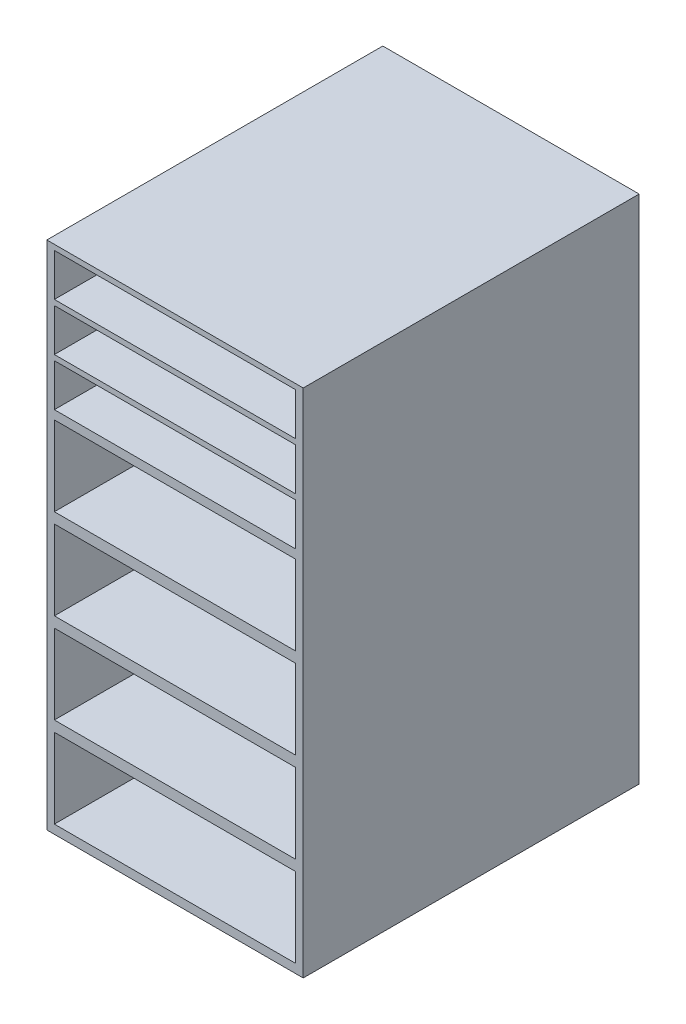
ISO-10303-21;
HEADER;
FILE_DESCRIPTION(('STEP AP214'),'2;1');
FILE_NAME('part.step','',(''),(''),'','','');
FILE_SCHEMA(('AUTOMOTIVE_DESIGN { 1 0 10303 214 1 1 1 1 }'));
ENDSEC;
DATA;
#1=APPLICATION_CONTEXT('core data for automotive mechanical design processes');
#2=APPLICATION_PROTOCOL_DEFINITION('international standard','automotive_design',2000,#1);
#3=PRODUCT_CONTEXT('',#1,'mechanical');
#4=PRODUCT('Part','Part','',(#3));
#5=PRODUCT_RELATED_PRODUCT_CATEGORY('part','',(#4));
#6=PRODUCT_DEFINITION_FORMATION('','',#4);
#7=PRODUCT_DEFINITION_CONTEXT('part definition',#1,'design');
#8=PRODUCT_DEFINITION('design','',#6,#7);
#9=PRODUCT_DEFINITION_SHAPE('','',#8);
#10=(LENGTH_UNIT() NAMED_UNIT(*) SI_UNIT(.MILLI.,.METRE.));
#11=(NAMED_UNIT(*) PLANE_ANGLE_UNIT() SI_UNIT($,.RADIAN.));
#12=(NAMED_UNIT(*) SI_UNIT($,.STERADIAN.) SOLID_ANGLE_UNIT());
#13=UNCERTAINTY_MEASURE_WITH_UNIT(LENGTH_MEASURE(1.E-05),#10,'distance_accuracy_value','');
#14=(GEOMETRIC_REPRESENTATION_CONTEXT(3) GLOBAL_UNCERTAINTY_ASSIGNED_CONTEXT((#13)) GLOBAL_UNIT_ASSIGNED_CONTEXT((#10,
#11,#12)) REPRESENTATION_CONTEXT('',''));
#15=CARTESIAN_POINT('',(0.,0.,0.));
#16=DIRECTION('',(0.,0.,1.));
#17=DIRECTION('',(1.,0.,0.));
#18=AXIS2_PLACEMENT_3D('',#15,#16,#17);
#19=CARTESIAN_POINT('',(34.1249999999999,144.5,47.5));
#20=DIRECTION('',(0.,1.,0.));
#21=DIRECTION('',(0.,0.,1.));
#22=AXIS2_PLACEMENT_3D('',#19,#20,#21);
#23=PLANE('',#22);
#24=DIRECTION('',(1.,0.,0.));
#25=VECTOR('',#24,1.);
#26=CARTESIAN_POINT('',(-34.1250000000001,144.5,47.5));
#27=LINE('',#26,#25);
#28=CARTESIAN_POINT('',(-36.25,144.5,47.5));
#29=VERTEX_POINT('',#28);
#30=CARTESIAN_POINT('',(36.25,144.5,47.5));
#31=VERTEX_POINT('',#30);
#32=EDGE_CURVE('E11',#29,#31,#27,.T.);
#33=ORIENTED_EDGE('',*,*,#32,.T.);
#34=DIRECTION('',(0.,0.,-1.));
#35=VECTOR('',#34,1.);
#36=CARTESIAN_POINT('',(36.25,144.5,47.5));
#37=LINE('',#36,#35);
#38=CARTESIAN_POINT('',(36.25,144.5,-47.5));
#39=VERTEX_POINT('',#38);
#40=EDGE_CURVE('E155',#31,#39,#37,.T.);
#41=ORIENTED_EDGE('',*,*,#40,.T.);
#42=DIRECTION('',(-1.,0.,0.));
#43=VECTOR('',#42,1.);
#44=CARTESIAN_POINT('',(-36.25,144.5,-47.5));
#45=LINE('',#44,#43);
#46=CARTESIAN_POINT('',(-36.25,144.5,-47.5));
#47=VERTEX_POINT('',#46);
#48=EDGE_CURVE('E160',#39,#47,#45,.T.);
#49=ORIENTED_EDGE('',*,*,#48,.T.);
#50=DIRECTION('',(0.,0.,1.));
#51=VECTOR('',#50,1.);
#52=CARTESIAN_POINT('',(-36.25,144.5,47.5));
#53=LINE('',#52,#51);
#54=EDGE_CURVE('E164',#47,#29,#53,.T.);
#55=ORIENTED_EDGE('',*,*,#54,.T.);
#56=EDGE_LOOP('',(#33,#41,#49,#55));
#57=FACE_BOUND('',#56,.T.);
#58=ADVANCED_FACE('F38',(#57),#23,.T.);
#59=CARTESIAN_POINT('',(36.25,104.5,47.5));
#60=DIRECTION('',(-1.,0.,0.));
#61=DIRECTION('',(0.,0.,1.));
#62=AXIS2_PLACEMENT_3D('',#59,#60,#61);
#63=PLANE('',#62);
#64=ORIENTED_EDGE('',*,*,#40,.F.);
#65=DIRECTION('',(0.,-1.,0.));
#66=VECTOR('',#65,1.);
#67=CARTESIAN_POINT('',(36.25,104.5,47.5));
#68=LINE('',#67,#66);
#69=CARTESIAN_POINT('',(36.25,0.,47.5));
#70=VERTEX_POINT('',#69);
#71=EDGE_CURVE('E42',#31,#70,#68,.T.);
#72=ORIENTED_EDGE('',*,*,#71,.T.);
#73=DIRECTION('',(0.,0.,-1.));
#74=VECTOR('',#73,1.);
#75=CARTESIAN_POINT('',(36.25,0.,47.5));
#76=LINE('',#75,#74);
#77=CARTESIAN_POINT('',(36.25,0.,-47.5));
#78=VERTEX_POINT('',#77);
#79=EDGE_CURVE('E203',#70,#78,#76,.T.);
#80=ORIENTED_EDGE('',*,*,#79,.T.);
#81=DIRECTION('',(0.,-1.,0.));
#82=VECTOR('',#81,1.);
#83=CARTESIAN_POINT('',(36.25,104.5,-47.5));
#84=LINE('',#83,#82);
#85=EDGE_CURVE('E159',#39,#78,#84,.T.);
#86=ORIENTED_EDGE('',*,*,#85,.F.);
#87=EDGE_LOOP('',(#64,#72,#80,#86));
#88=FACE_BOUND('',#87,.T.);
#89=ADVANCED_FACE('F630',(#88),#63,.F.);
#90=CARTESIAN_POINT('',(-36.25,104.5,-47.5));
#91=DIRECTION('',(0.,0.,1.));
#92=DIRECTION('',(1.,0.,0.));
#93=AXIS2_PLACEMENT_3D('',#90,#91,#92);
#94=PLANE('',#93);
#95=ORIENTED_EDGE('',*,*,#48,.F.);
#96=ORIENTED_EDGE('',*,*,#85,.T.);
#97=DIRECTION('',(-1.,0.,0.));
#98=VECTOR('',#97,1.);
#99=CARTESIAN_POINT('',(-36.25,0.,-47.5));
#100=LINE('',#99,#98);
#101=CARTESIAN_POINT('',(-36.25,0.,-47.5));
#102=VERTEX_POINT('',#101);
#103=EDGE_CURVE('E197',#78,#102,#100,.T.);
#104=ORIENTED_EDGE('',*,*,#103,.T.);
#105=DIRECTION('',(0.,-1.,0.));
#106=VECTOR('',#105,1.);
#107=CARTESIAN_POINT('',(-36.25,104.5,-47.5));
#108=LINE('',#107,#106);
#109=EDGE_CURVE('E171',#47,#102,#108,.T.);
#110=ORIENTED_EDGE('',*,*,#109,.F.);
#111=EDGE_LOOP('',(#95,#96,#104,#110));
#112=FACE_BOUND('',#111,.T.);
#113=ADVANCED_FACE('F632',(#112),#94,.F.);
#114=CARTESIAN_POINT('',(-36.25,104.5,47.5));
#115=DIRECTION('',(1.,0.,0.));
#116=DIRECTION('',(0.,0.,-1.));
#117=AXIS2_PLACEMENT_3D('',#114,#115,#116);
#118=PLANE('',#117);
#119=ORIENTED_EDGE('',*,*,#54,.F.);
#120=ORIENTED_EDGE('',*,*,#109,.T.);
#121=DIRECTION('',(0.,0.,1.));
#122=VECTOR('',#121,1.);
#123=CARTESIAN_POINT('',(-36.25,0.,47.5));
#124=LINE('',#123,#122);
#125=CARTESIAN_POINT('',(-36.25,0.,47.5));
#126=VERTEX_POINT('',#125);
#127=EDGE_CURVE('E192',#102,#126,#124,.T.);
#128=ORIENTED_EDGE('',*,*,#127,.T.);
#129=DIRECTION('',(0.,-1.,0.));
#130=VECTOR('',#129,1.);
#131=CARTESIAN_POINT('',(-36.25,104.5,47.5));
#132=LINE('',#131,#130);
#133=EDGE_CURVE('E174',#29,#126,#132,.T.);
#134=ORIENTED_EDGE('',*,*,#133,.F.);
#135=EDGE_LOOP('',(#119,#120,#128,#134));
#136=FACE_BOUND('',#135,.T.);
#137=ADVANCED_FACE('F638',(#136),#118,.F.);
#138=CARTESIAN_POINT('',(-36.25,104.5,47.5));
#139=DIRECTION('',(0.,0.,-1.));
#140=DIRECTION('',(-1.,0.,0.));
#141=AXIS2_PLACEMENT_3D('',#138,#139,#140);
#142=PLANE('',#141);
#143=DIRECTION('',(0.,-1.,0.));
#144=VECTOR('',#143,1.);
#145=CARTESIAN_POINT('',(-34.1250000000003,79.,47.5));
#146=LINE('',#145,#144);
#147=CARTESIAN_POINT('',(-34.1250000000003,101.5,47.5));
#148=VERTEX_POINT('',#147);
#149=CARTESIAN_POINT('',(-34.1250000000003,79.,47.5));
#150=VERTEX_POINT('',#149);
#151=EDGE_CURVE('E234',#148,#150,#146,.T.);
#152=ORIENTED_EDGE('',*,*,#151,.F.);
#153=DIRECTION('',(-1.,0.,0.));
#154=VECTOR('',#153,1.);
#155=CARTESIAN_POINT('',(-34.1250000000003,101.5,47.5));
#156=LINE('',#155,#154);
#157=CARTESIAN_POINT('',(34.1249999999997,101.5,47.5));
#158=VERTEX_POINT('',#157);
#159=EDGE_CURVE('E238',#158,#148,#156,.T.);
#160=ORIENTED_EDGE('',*,*,#159,.F.);
#161=DIRECTION('',(0.,1.,0.));
#162=VECTOR('',#161,1.);
#163=CARTESIAN_POINT('',(34.1249999999997,79.,47.5));
#164=LINE('',#163,#162);
#165=CARTESIAN_POINT('',(34.1249999999997,79.,47.5));
#166=VERTEX_POINT('',#165);
#167=EDGE_CURVE('E225',#166,#158,#164,.T.);
#168=ORIENTED_EDGE('',*,*,#167,.F.);
#169=DIRECTION('',(1.,0.,0.));
#170=VECTOR('',#169,1.);
#171=CARTESIAN_POINT('',(-34.1250000000003,79.,47.5));
#172=LINE('',#171,#170);
#173=EDGE_CURVE('E229',#150,#166,#172,.T.);
#174=ORIENTED_EDGE('',*,*,#173,.F.);
#175=EDGE_LOOP('',(#152,#160,#168,#174));
#176=FACE_BOUND('',#175,.T.);
#177=DIRECTION('',(0.,-1.,0.));
#178=VECTOR('',#177,1.);
#179=CARTESIAN_POINT('',(-34.1250000000002,53.5,47.5));
#180=LINE('',#179,#178);
#181=CARTESIAN_POINT('',(-34.1250000000002,76.,47.5));
#182=VERTEX_POINT('',#181);
#183=CARTESIAN_POINT('',(-34.1250000000002,53.5,47.5));
#184=VERTEX_POINT('',#183);
#185=EDGE_CURVE('E284',#182,#184,#180,.T.);
#186=ORIENTED_EDGE('',*,*,#185,.F.);
#187=DIRECTION('',(-1.,0.,0.));
#188=VECTOR('',#187,1.);
#189=CARTESIAN_POINT('',(-34.1250000000002,76.,47.5));
#190=LINE('',#189,#188);
#191=CARTESIAN_POINT('',(34.1249999999998,76.,47.5));
#192=VERTEX_POINT('',#191);
#193=EDGE_CURVE('E224',#192,#182,#190,.T.);
#194=ORIENTED_EDGE('',*,*,#193,.F.);
#195=DIRECTION('',(0.,1.,0.));
#196=VECTOR('',#195,1.);
#197=CARTESIAN_POINT('',(34.1249999999998,53.5,47.5));
#198=LINE('',#197,#196);
#199=CARTESIAN_POINT('',(34.1249999999998,53.5,47.5));
#200=VERTEX_POINT('',#199);
#201=EDGE_CURVE('E275',#200,#192,#198,.T.);
#202=ORIENTED_EDGE('',*,*,#201,.F.);
#203=DIRECTION('',(1.,0.,0.));
#204=VECTOR('',#203,1.);
#205=CARTESIAN_POINT('',(-34.1250000000002,53.5,47.5));
#206=LINE('',#205,#204);
#207=EDGE_CURVE('E279',#184,#200,#206,.T.);
#208=ORIENTED_EDGE('',*,*,#207,.F.);
#209=EDGE_LOOP('',(#186,#194,#202,#208));
#210=FACE_BOUND('',#209,.T.);
#211=DIRECTION('',(0.,-1.,0.));
#212=VECTOR('',#211,1.);
#213=CARTESIAN_POINT('',(-34.1250000000001,28.,47.5));
#214=LINE('',#213,#212);
#215=CARTESIAN_POINT('',(-34.1250000000001,50.5,47.5));
#216=VERTEX_POINT('',#215);
#217=CARTESIAN_POINT('',(-34.1250000000001,28.,47.5));
#218=VERTEX_POINT('',#217);
#219=EDGE_CURVE('E332',#216,#218,#214,.T.);
#220=ORIENTED_EDGE('',*,*,#219,.F.);
#221=DIRECTION('',(-1.,0.,0.));
#222=VECTOR('',#221,1.);
#223=CARTESIAN_POINT('',(-34.1250000000001,50.5,47.5));
#224=LINE('',#223,#222);
#225=CARTESIAN_POINT('',(34.1249999999999,50.5,47.5));
#226=VERTEX_POINT('',#225);
#227=EDGE_CURVE('E274',#226,#216,#224,.T.);
#228=ORIENTED_EDGE('',*,*,#227,.F.);
#229=DIRECTION('',(0.,1.,0.));
#230=VECTOR('',#229,1.);
#231=CARTESIAN_POINT('',(34.1249999999999,28.,47.5));
#232=LINE('',#231,#230);
#233=CARTESIAN_POINT('',(34.1249999999999,28.,47.5));
#234=VERTEX_POINT('',#233);
#235=EDGE_CURVE('E323',#234,#226,#232,.T.);
#236=ORIENTED_EDGE('',*,*,#235,.F.);
#237=DIRECTION('',(1.,0.,0.));
#238=VECTOR('',#237,1.);
#239=CARTESIAN_POINT('',(-34.1250000000001,28.,47.5));
#240=LINE('',#239,#238);
#241=EDGE_CURVE('E327',#218,#234,#240,.T.);
#242=ORIENTED_EDGE('',*,*,#241,.F.);
#243=EDGE_LOOP('',(#220,#228,#236,#242));
#244=FACE_BOUND('',#243,.T.);
#245=DIRECTION('',(-1.,0.,0.));
#246=VECTOR('',#245,1.);
#247=CARTESIAN_POINT('',(-34.125,25.,47.5));
#248=LINE('',#247,#246);
#249=CARTESIAN_POINT('',(34.125,25.,47.5));
#250=VERTEX_POINT('',#249);
#251=CARTESIAN_POINT('',(-34.125,25.,47.5));
#252=VERTEX_POINT('',#251);
#253=EDGE_CURVE('E378',#250,#252,#248,.T.);
#254=ORIENTED_EDGE('',*,*,#253,.F.);
#255=DIRECTION('',(0.,1.,0.));
#256=VECTOR('',#255,1.);
#257=CARTESIAN_POINT('',(34.125,2.5,47.5));
#258=LINE('',#257,#256);
#259=CARTESIAN_POINT('',(34.125,2.5,47.5));
#260=VERTEX_POINT('',#259);
#261=EDGE_CURVE('E322',#260,#250,#258,.T.);
#262=ORIENTED_EDGE('',*,*,#261,.F.);
#263=DIRECTION('',(1.,0.,0.));
#264=VECTOR('',#263,1.);
#265=CARTESIAN_POINT('',(-34.125,2.5,47.5));
#266=LINE('',#265,#264);
#267=CARTESIAN_POINT('',(-34.125,2.5,47.5));
#268=VERTEX_POINT('',#267);
#269=EDGE_CURVE('E369',#268,#260,#266,.T.);
#270=ORIENTED_EDGE('',*,*,#269,.F.);
#271=DIRECTION('',(0.,-1.,0.));
#272=VECTOR('',#271,1.);
#273=CARTESIAN_POINT('',(-34.125,2.5,47.5));
#274=LINE('',#273,#272);
#275=EDGE_CURVE('E373',#252,#268,#274,.T.);
#276=ORIENTED_EDGE('',*,*,#275,.F.);
#277=EDGE_LOOP('',(#254,#262,#270,#276));
#278=FACE_BOUND('',#277,.T.);
#279=DIRECTION('',(0.,-1.,0.));
#280=VECTOR('',#279,1.);
#281=CARTESIAN_POINT('',(-34.125,131.,47.5));
#282=LINE('',#281,#280);
#283=CARTESIAN_POINT('',(-34.125,143.,47.5));
#284=VERTEX_POINT('',#283);
#285=CARTESIAN_POINT('',(-34.125,131.,47.5));
#286=VERTEX_POINT('',#285);
#287=EDGE_CURVE('E422',#284,#286,#282,.T.);
#288=ORIENTED_EDGE('',*,*,#287,.F.);
#289=DIRECTION('',(-1.,0.,0.));
#290=VECTOR('',#289,1.);
#291=CARTESIAN_POINT('',(-34.125,143.,47.5));
#292=LINE('',#291,#290);
#293=CARTESIAN_POINT('',(34.125,143.,47.5));
#294=VERTEX_POINT('',#293);
#295=EDGE_CURVE('E49',#294,#284,#292,.T.);
#296=ORIENTED_EDGE('',*,*,#295,.F.);
#297=DIRECTION('',(0.,1.,0.));
#298=VECTOR('',#297,1.);
#299=CARTESIAN_POINT('',(34.125,131.,47.5));
#300=LINE('',#299,#298);
#301=CARTESIAN_POINT('',(34.125,131.,47.5));
#302=VERTEX_POINT('',#301);
#303=EDGE_CURVE('E414',#302,#294,#300,.T.);
#304=ORIENTED_EDGE('',*,*,#303,.F.);
#305=DIRECTION('',(1.,0.,0.));
#306=VECTOR('',#305,1.);
#307=CARTESIAN_POINT('',(-34.125,131.,47.5));
#308=LINE('',#307,#306);
#309=EDGE_CURVE('E418',#286,#302,#308,.T.);
#310=ORIENTED_EDGE('',*,*,#309,.F.);
#311=EDGE_LOOP('',(#288,#296,#304,#310));
#312=FACE_BOUND('',#311,.T.);
#313=DIRECTION('',(0.,-1.,0.));
#314=VECTOR('',#313,1.);
#315=CARTESIAN_POINT('',(-34.125,117.5,47.5));
#316=LINE('',#315,#314);
#317=CARTESIAN_POINT('',(-34.125,129.5,47.5));
#318=VERTEX_POINT('',#317);
#319=CARTESIAN_POINT('',(-34.125,117.5,47.5));
#320=VERTEX_POINT('',#319);
#321=EDGE_CURVE('E465',#318,#320,#316,.T.);
#322=ORIENTED_EDGE('',*,*,#321,.F.);
#323=DIRECTION('',(-1.,0.,0.));
#324=VECTOR('',#323,1.);
#325=CARTESIAN_POINT('',(-34.125,129.5,47.5));
#326=LINE('',#325,#324);
#327=CARTESIAN_POINT('',(34.125,129.5,47.5));
#328=VERTEX_POINT('',#327);
#329=EDGE_CURVE('E413',#328,#318,#326,.T.);
#330=ORIENTED_EDGE('',*,*,#329,.F.);
#331=DIRECTION('',(0.,1.,0.));
#332=VECTOR('',#331,1.);
#333=CARTESIAN_POINT('',(34.125,117.5,47.5));
#334=LINE('',#333,#332);
#335=CARTESIAN_POINT('',(34.125,117.5,47.5));
#336=VERTEX_POINT('',#335);
#337=EDGE_CURVE('E456',#336,#328,#334,.T.);
#338=ORIENTED_EDGE('',*,*,#337,.F.);
#339=DIRECTION('',(1.,0.,0.));
#340=VECTOR('',#339,1.);
#341=CARTESIAN_POINT('',(-34.125,117.5,47.5));
#342=LINE('',#341,#340);
#343=EDGE_CURVE('E460',#320,#336,#342,.T.);
#344=ORIENTED_EDGE('',*,*,#343,.F.);
#345=EDGE_LOOP('',(#322,#330,#338,#344));
#346=FACE_BOUND('',#345,.T.);
#347=DIRECTION('',(-1.,0.,0.));
#348=VECTOR('',#347,1.);
#349=CARTESIAN_POINT('',(-34.125,116.,47.5));
#350=LINE('',#349,#348);
#351=CARTESIAN_POINT('',(34.125,116.,47.5));
#352=VERTEX_POINT('',#351);
#353=CARTESIAN_POINT('',(-34.125,116.,47.5));
#354=VERTEX_POINT('',#353);
#355=EDGE_CURVE('E496',#352,#354,#350,.T.);
#356=ORIENTED_EDGE('',*,*,#355,.F.);
#357=DIRECTION('',(0.,1.,0.));
#358=VECTOR('',#357,1.);
#359=CARTESIAN_POINT('',(34.125,104.,47.5));
#360=LINE('',#359,#358);
#361=CARTESIAN_POINT('',(34.125,104.,47.5));
#362=VERTEX_POINT('',#361);
#363=EDGE_CURVE('E131',#362,#352,#360,.T.);
#364=ORIENTED_EDGE('',*,*,#363,.F.);
#365=DIRECTION('',(1.,0.,0.));
#366=VECTOR('',#365,1.);
#367=CARTESIAN_POINT('',(-34.125,104.,47.5));
#368=LINE('',#367,#366);
#369=CARTESIAN_POINT('',(-34.125,104.,47.5));
#370=VERTEX_POINT('',#369);
#371=EDGE_CURVE('E147',#370,#362,#368,.T.);
#372=ORIENTED_EDGE('',*,*,#371,.F.);
#373=DIRECTION('',(0.,-1.,0.));
#374=VECTOR('',#373,1.);
#375=CARTESIAN_POINT('',(-34.125,104.,47.5));
#376=LINE('',#375,#374);
#377=EDGE_CURVE('E151',#354,#370,#376,.T.);
#378=ORIENTED_EDGE('',*,*,#377,.F.);
#379=EDGE_LOOP('',(#356,#364,#372,#378));
#380=FACE_BOUND('',#379,.T.);
#381=ORIENTED_EDGE('',*,*,#32,.F.);
#382=ORIENTED_EDGE('',*,*,#133,.T.);
#383=DIRECTION('',(1.,0.,0.));
#384=VECTOR('',#383,1.);
#385=CARTESIAN_POINT('',(-36.25,0.,47.5));
#386=LINE('',#385,#384);
#387=EDGE_CURVE('E185',#126,#70,#386,.T.);
#388=ORIENTED_EDGE('',*,*,#387,.T.);
#389=ORIENTED_EDGE('',*,*,#71,.F.);
#390=EDGE_LOOP('',(#381,#382,#388,#389));
#391=FACE_BOUND('',#390,.T.);
#392=ADVANCED_FACE('F40',(#176,#210,#244,#278,#312,#346,#380,#391),#142,.F.);
#393=CARTESIAN_POINT('',(0.,0.,0.));
#394=DIRECTION('',(0.,-1.,0.));
#395=DIRECTION('',(0.,0.,-1.));
#396=AXIS2_PLACEMENT_3D('',#393,#394,#395);
#397=PLANE('',#396);
#398=ORIENTED_EDGE('',*,*,#79,.F.);
#399=ORIENTED_EDGE('',*,*,#387,.F.);
#400=ORIENTED_EDGE('',*,*,#127,.F.);
#401=ORIENTED_EDGE('',*,*,#103,.F.);
#402=EDGE_LOOP('',(#398,#399,#400,#401));
#403=FACE_BOUND('',#402,.T.);
#404=ADVANCED_FACE('F649',(#403),#397,.T.);
#405=CARTESIAN_POINT('',(-34.1250000000003,101.5,-42.5));
#406=DIRECTION('',(0.,1.,0.));
#407=DIRECTION('',(0.,0.,1.));
#408=AXIS2_PLACEMENT_3D('',#405,#406,#407);
#409=PLANE('',#408);
#410=ORIENTED_EDGE('',*,*,#159,.T.);
#411=DIRECTION('',(0.,0.,1.));
#412=VECTOR('',#411,1.);
#413=CARTESIAN_POINT('',(-34.1250000000003,101.5,-42.5));
#414=LINE('',#413,#412);
#415=CARTESIAN_POINT('',(-34.1250000000003,101.5,-42.5));
#416=VERTEX_POINT('',#415);
#417=EDGE_CURVE('E207',#416,#148,#414,.T.);
#418=ORIENTED_EDGE('',*,*,#417,.F.);
#419=DIRECTION('',(-1.,0.,0.));
#420=VECTOR('',#419,1.);
#421=CARTESIAN_POINT('',(-34.1250000000003,101.5,-42.5));
#422=LINE('',#421,#420);
#423=CARTESIAN_POINT('',(34.1249999999997,101.5,-42.5));
#424=VERTEX_POINT('',#423);
#425=EDGE_CURVE('E230',#424,#416,#422,.T.);
#426=ORIENTED_EDGE('',*,*,#425,.F.);
#427=DIRECTION('',(0.,0.,1.));
#428=VECTOR('',#427,1.);
#429=CARTESIAN_POINT('',(34.1249999999997,101.5,-42.5));
#430=LINE('',#429,#428);
#431=EDGE_CURVE('E220',#424,#158,#430,.T.);
#432=ORIENTED_EDGE('',*,*,#431,.T.);
#433=EDGE_LOOP('',(#410,#418,#426,#432));
#434=FACE_BOUND('',#433,.T.);
#435=ADVANCED_FACE('F662',(#434),#409,.F.);
#436=CARTESIAN_POINT('',(34.1249999999997,79.,-42.5));
#437=DIRECTION('',(1.,0.,0.));
#438=DIRECTION('',(0.,1.,0.));
#439=AXIS2_PLACEMENT_3D('',#436,#437,#438);
#440=PLANE('',#439);
#441=ORIENTED_EDGE('',*,*,#167,.T.);
#442=ORIENTED_EDGE('',*,*,#431,.F.);
#443=DIRECTION('',(0.,1.,0.));
#444=VECTOR('',#443,1.);
#445=CARTESIAN_POINT('',(34.1249999999997,79.,-42.5));
#446=LINE('',#445,#444);
#447=CARTESIAN_POINT('',(34.1249999999997,79.,-42.5));
#448=VERTEX_POINT('',#447);
#449=EDGE_CURVE('E211',#448,#424,#446,.T.);
#450=ORIENTED_EDGE('',*,*,#449,.F.);
#451=DIRECTION('',(0.,0.,1.));
#452=VECTOR('',#451,1.);
#453=CARTESIAN_POINT('',(34.1249999999997,79.,-42.5));
#454=LINE('',#453,#452);
#455=EDGE_CURVE('E216',#448,#166,#454,.T.);
#456=ORIENTED_EDGE('',*,*,#455,.T.);
#457=EDGE_LOOP('',(#441,#442,#450,#456));
#458=FACE_BOUND('',#457,.T.);
#459=ADVANCED_FACE('F667',(#458),#440,.F.);
#460=CARTESIAN_POINT('',(-34.1250000000003,79.,-42.5));
#461=DIRECTION('',(0.,-1.,0.));
#462=DIRECTION('',(0.,0.,-1.));
#463=AXIS2_PLACEMENT_3D('',#460,#461,#462);
#464=PLANE('',#463);
#465=ORIENTED_EDGE('',*,*,#173,.T.);
#466=ORIENTED_EDGE('',*,*,#455,.F.);
#467=DIRECTION('',(1.,0.,0.));
#468=VECTOR('',#467,1.);
#469=CARTESIAN_POINT('',(-34.1250000000003,79.,-42.5));
#470=LINE('',#469,#468);
#471=CARTESIAN_POINT('',(-34.1250000000003,79.,-42.5));
#472=VERTEX_POINT('',#471);
#473=EDGE_CURVE('E246',#472,#448,#470,.T.);
#474=ORIENTED_EDGE('',*,*,#473,.F.);
#475=DIRECTION('',(0.,0.,1.));
#476=VECTOR('',#475,1.);
#477=CARTESIAN_POINT('',(-34.1250000000003,79.,-42.5));
#478=LINE('',#477,#476);
#479=EDGE_CURVE('E212',#472,#150,#478,.T.);
#480=ORIENTED_EDGE('',*,*,#479,.T.);
#481=EDGE_LOOP('',(#465,#466,#474,#480));
#482=FACE_BOUND('',#481,.T.);
#483=ADVANCED_FACE('F675',(#482),#464,.F.);
#484=CARTESIAN_POINT('',(-34.1250000000003,79.,-42.5));
#485=DIRECTION('',(-1.,0.,0.));
#486=DIRECTION('',(0.,-1.,0.));
#487=AXIS2_PLACEMENT_3D('',#484,#485,#486);
#488=PLANE('',#487);
#489=ORIENTED_EDGE('',*,*,#151,.T.);
#490=ORIENTED_EDGE('',*,*,#479,.F.);
#491=DIRECTION('',(0.,-1.,0.));
#492=VECTOR('',#491,1.);
#493=CARTESIAN_POINT('',(-34.1250000000003,79.,-42.5));
#494=LINE('',#493,#492);
#495=EDGE_CURVE('E250',#416,#472,#494,.T.);
#496=ORIENTED_EDGE('',*,*,#495,.F.);
#497=ORIENTED_EDGE('',*,*,#417,.T.);
#498=EDGE_LOOP('',(#489,#490,#496,#497));
#499=FACE_BOUND('',#498,.T.);
#500=ADVANCED_FACE('F671',(#499),#488,.F.);
#501=CARTESIAN_POINT('',(0.,0.,-42.5));
#502=DIRECTION('',(0.,0.,1.));
#503=DIRECTION('',(1.,0.,0.));
#504=AXIS2_PLACEMENT_3D('',#501,#502,#503);
#505=PLANE('',#504);
#506=ORIENTED_EDGE('',*,*,#425,.T.);
#507=ORIENTED_EDGE('',*,*,#495,.T.);
#508=ORIENTED_EDGE('',*,*,#473,.T.);
#509=ORIENTED_EDGE('',*,*,#449,.T.);
#510=EDGE_LOOP('',(#506,#507,#508,#509));
#511=FACE_BOUND('',#510,.T.);
#512=ADVANCED_FACE('F674',(#511),#505,.T.);
#513=CARTESIAN_POINT('',(-34.1250000000002,76.,-42.5));
#514=DIRECTION('',(0.,1.,0.));
#515=DIRECTION('',(0.,0.,1.));
#516=AXIS2_PLACEMENT_3D('',#513,#514,#515);
#517=PLANE('',#516);
#518=ORIENTED_EDGE('',*,*,#193,.T.);
#519=DIRECTION('',(0.,0.,1.));
#520=VECTOR('',#519,1.);
#521=CARTESIAN_POINT('',(-34.1250000000002,76.,-42.5));
#522=LINE('',#521,#520);
#523=CARTESIAN_POINT('',(-34.1250000000002,76.,-42.5));
#524=VERTEX_POINT('',#523);
#525=EDGE_CURVE('E257',#524,#182,#522,.T.);
#526=ORIENTED_EDGE('',*,*,#525,.F.);
#527=DIRECTION('',(-1.,0.,0.));
#528=VECTOR('',#527,1.);
#529=CARTESIAN_POINT('',(-34.1250000000002,76.,-42.5));
#530=LINE('',#529,#528);
#531=CARTESIAN_POINT('',(34.1249999999998,76.,-42.5));
#532=VERTEX_POINT('',#531);
#533=EDGE_CURVE('E280',#532,#524,#530,.T.);
#534=ORIENTED_EDGE('',*,*,#533,.F.);
#535=DIRECTION('',(0.,0.,1.));
#536=VECTOR('',#535,1.);
#537=CARTESIAN_POINT('',(34.1249999999998,76.,-42.5));
#538=LINE('',#537,#536);
#539=EDGE_CURVE('E270',#532,#192,#538,.T.);
#540=ORIENTED_EDGE('',*,*,#539,.T.);
#541=EDGE_LOOP('',(#518,#526,#534,#540));
#542=FACE_BOUND('',#541,.T.);
#543=ADVANCED_FACE('F685',(#542),#517,.F.);
#544=CARTESIAN_POINT('',(34.1249999999998,53.5,-42.5));
#545=DIRECTION('',(1.,0.,0.));
#546=DIRECTION('',(0.,1.,0.));
#547=AXIS2_PLACEMENT_3D('',#544,#545,#546);
#548=PLANE('',#547);
#549=ORIENTED_EDGE('',*,*,#201,.T.);
#550=ORIENTED_EDGE('',*,*,#539,.F.);
#551=DIRECTION('',(0.,1.,0.));
#552=VECTOR('',#551,1.);
#553=CARTESIAN_POINT('',(34.1249999999998,53.5,-42.5));
#554=LINE('',#553,#552);
#555=CARTESIAN_POINT('',(34.1249999999998,53.5,-42.5));
#556=VERTEX_POINT('',#555);
#557=EDGE_CURVE('E261',#556,#532,#554,.T.);
#558=ORIENTED_EDGE('',*,*,#557,.F.);
#559=DIRECTION('',(0.,0.,1.));
#560=VECTOR('',#559,1.);
#561=CARTESIAN_POINT('',(34.1249999999998,53.5,-42.5));
#562=LINE('',#561,#560);
#563=EDGE_CURVE('E266',#556,#200,#562,.T.);
#564=ORIENTED_EDGE('',*,*,#563,.T.);
#565=EDGE_LOOP('',(#549,#550,#558,#564));
#566=FACE_BOUND('',#565,.T.);
#567=ADVANCED_FACE('F689',(#566),#548,.F.);
#568=CARTESIAN_POINT('',(-34.1250000000002,53.5,-42.5));
#569=DIRECTION('',(0.,-1.,0.));
#570=DIRECTION('',(0.,0.,-1.));
#571=AXIS2_PLACEMENT_3D('',#568,#569,#570);
#572=PLANE('',#571);
#573=ORIENTED_EDGE('',*,*,#207,.T.);
#574=ORIENTED_EDGE('',*,*,#563,.F.);
#575=DIRECTION('',(1.,0.,0.));
#576=VECTOR('',#575,1.);
#577=CARTESIAN_POINT('',(-34.1250000000002,53.5,-42.5));
#578=LINE('',#577,#576);
#579=CARTESIAN_POINT('',(-34.1250000000002,53.5,-42.5));
#580=VERTEX_POINT('',#579);
#581=EDGE_CURVE('E294',#580,#556,#578,.T.);
#582=ORIENTED_EDGE('',*,*,#581,.F.);
#583=DIRECTION('',(0.,0.,1.));
#584=VECTOR('',#583,1.);
#585=CARTESIAN_POINT('',(-34.1250000000002,53.5,-42.5));
#586=LINE('',#585,#584);
#587=EDGE_CURVE('E262',#580,#184,#586,.T.);
#588=ORIENTED_EDGE('',*,*,#587,.T.);
#589=EDGE_LOOP('',(#573,#574,#582,#588));
#590=FACE_BOUND('',#589,.T.);
#591=ADVANCED_FACE('F695',(#590),#572,.F.);
#592=CARTESIAN_POINT('',(-34.1250000000002,53.5,-42.5));
#593=DIRECTION('',(-1.,0.,0.));
#594=DIRECTION('',(0.,-1.,0.));
#595=AXIS2_PLACEMENT_3D('',#592,#593,#594);
#596=PLANE('',#595);
#597=ORIENTED_EDGE('',*,*,#185,.T.);
#598=ORIENTED_EDGE('',*,*,#587,.F.);
#599=DIRECTION('',(0.,-1.,0.));
#600=VECTOR('',#599,1.);
#601=CARTESIAN_POINT('',(-34.1250000000002,53.5,-42.5));
#602=LINE('',#601,#600);
#603=EDGE_CURVE('E298',#524,#580,#602,.T.);
#604=ORIENTED_EDGE('',*,*,#603,.F.);
#605=ORIENTED_EDGE('',*,*,#525,.T.);
#606=EDGE_LOOP('',(#597,#598,#604,#605));
#607=FACE_BOUND('',#606,.T.);
#608=ADVANCED_FACE('F691',(#607),#596,.F.);
#609=CARTESIAN_POINT('',(0.,0.,-42.5));
#610=DIRECTION('',(0.,0.,1.));
#611=DIRECTION('',(1.,0.,0.));
#612=AXIS2_PLACEMENT_3D('',#609,#610,#611);
#613=PLANE('',#612);
#614=ORIENTED_EDGE('',*,*,#533,.T.);
#615=ORIENTED_EDGE('',*,*,#603,.T.);
#616=ORIENTED_EDGE('',*,*,#581,.T.);
#617=ORIENTED_EDGE('',*,*,#557,.T.);
#618=EDGE_LOOP('',(#614,#615,#616,#617));
#619=FACE_BOUND('',#618,.T.);
#620=ADVANCED_FACE('F694',(#619),#613,.T.);
#621=CARTESIAN_POINT('',(-34.1250000000001,50.5,-42.5));
#622=DIRECTION('',(0.,1.,0.));
#623=DIRECTION('',(0.,0.,1.));
#624=AXIS2_PLACEMENT_3D('',#621,#622,#623);
#625=PLANE('',#624);
#626=ORIENTED_EDGE('',*,*,#227,.T.);
#627=DIRECTION('',(0.,0.,1.));
#628=VECTOR('',#627,1.);
#629=CARTESIAN_POINT('',(-34.1250000000001,50.5,-42.5));
#630=LINE('',#629,#628);
#631=CARTESIAN_POINT('',(-34.1250000000001,50.5,-42.5));
#632=VERTEX_POINT('',#631);
#633=EDGE_CURVE('E305',#632,#216,#630,.T.);
#634=ORIENTED_EDGE('',*,*,#633,.F.);
#635=DIRECTION('',(-1.,0.,0.));
#636=VECTOR('',#635,1.);
#637=CARTESIAN_POINT('',(-34.1250000000001,50.5,-42.5));
#638=LINE('',#637,#636);
#639=CARTESIAN_POINT('',(34.1249999999999,50.5,-42.5));
#640=VERTEX_POINT('',#639);
#641=EDGE_CURVE('E328',#640,#632,#638,.T.);
#642=ORIENTED_EDGE('',*,*,#641,.F.);
#643=DIRECTION('',(0.,0.,1.));
#644=VECTOR('',#643,1.);
#645=CARTESIAN_POINT('',(34.1249999999999,50.5,-42.5));
#646=LINE('',#645,#644);
#647=EDGE_CURVE('E318',#640,#226,#646,.T.);
#648=ORIENTED_EDGE('',*,*,#647,.T.);
#649=EDGE_LOOP('',(#626,#634,#642,#648));
#650=FACE_BOUND('',#649,.T.);
#651=ADVANCED_FACE('F705',(#650),#625,.F.);
#652=CARTESIAN_POINT('',(34.1249999999999,28.,-42.5));
#653=DIRECTION('',(1.,0.,0.));
#654=DIRECTION('',(0.,1.,0.));
#655=AXIS2_PLACEMENT_3D('',#652,#653,#654);
#656=PLANE('',#655);
#657=ORIENTED_EDGE('',*,*,#235,.T.);
#658=ORIENTED_EDGE('',*,*,#647,.F.);
#659=DIRECTION('',(0.,1.,0.));
#660=VECTOR('',#659,1.);
#661=CARTESIAN_POINT('',(34.1249999999999,28.,-42.5));
#662=LINE('',#661,#660);
#663=CARTESIAN_POINT('',(34.1249999999999,28.,-42.5));
#664=VERTEX_POINT('',#663);
#665=EDGE_CURVE('E309',#664,#640,#662,.T.);
#666=ORIENTED_EDGE('',*,*,#665,.F.);
#667=DIRECTION('',(0.,0.,1.));
#668=VECTOR('',#667,1.);
#669=CARTESIAN_POINT('',(34.1249999999999,28.,-42.5));
#670=LINE('',#669,#668);
#671=EDGE_CURVE('E314',#664,#234,#670,.T.);
#672=ORIENTED_EDGE('',*,*,#671,.T.);
#673=EDGE_LOOP('',(#657,#658,#666,#672));
#674=FACE_BOUND('',#673,.T.);
#675=ADVANCED_FACE('F709',(#674),#656,.F.);
#676=CARTESIAN_POINT('',(-34.1250000000001,28.,-42.5));
#677=DIRECTION('',(0.,-1.,0.));
#678=DIRECTION('',(0.,0.,-1.));
#679=AXIS2_PLACEMENT_3D('',#676,#677,#678);
#680=PLANE('',#679);
#681=ORIENTED_EDGE('',*,*,#241,.T.);
#682=ORIENTED_EDGE('',*,*,#671,.F.);
#683=DIRECTION('',(1.,0.,0.));
#684=VECTOR('',#683,1.);
#685=CARTESIAN_POINT('',(-34.1250000000001,28.,-42.5));
#686=LINE('',#685,#684);
#687=CARTESIAN_POINT('',(-34.1250000000001,28.,-42.5));
#688=VERTEX_POINT('',#687);
#689=EDGE_CURVE('E342',#688,#664,#686,.T.);
#690=ORIENTED_EDGE('',*,*,#689,.F.);
#691=DIRECTION('',(0.,0.,1.));
#692=VECTOR('',#691,1.);
#693=CARTESIAN_POINT('',(-34.1250000000001,28.,-42.5));
#694=LINE('',#693,#692);
#695=EDGE_CURVE('E310',#688,#218,#694,.T.);
#696=ORIENTED_EDGE('',*,*,#695,.T.);
#697=EDGE_LOOP('',(#681,#682,#690,#696));
#698=FACE_BOUND('',#697,.T.);
#699=ADVANCED_FACE('F715',(#698),#680,.F.);
#700=CARTESIAN_POINT('',(-34.1250000000001,28.,-42.5));
#701=DIRECTION('',(-1.,0.,0.));
#702=DIRECTION('',(0.,-1.,0.));
#703=AXIS2_PLACEMENT_3D('',#700,#701,#702);
#704=PLANE('',#703);
#705=ORIENTED_EDGE('',*,*,#219,.T.);
#706=ORIENTED_EDGE('',*,*,#695,.F.);
#707=DIRECTION('',(0.,-1.,0.));
#708=VECTOR('',#707,1.);
#709=CARTESIAN_POINT('',(-34.1250000000001,28.,-42.5));
#710=LINE('',#709,#708);
#711=EDGE_CURVE('E346',#632,#688,#710,.T.);
#712=ORIENTED_EDGE('',*,*,#711,.F.);
#713=ORIENTED_EDGE('',*,*,#633,.T.);
#714=EDGE_LOOP('',(#705,#706,#712,#713));
#715=FACE_BOUND('',#714,.T.);
#716=ADVANCED_FACE('F711',(#715),#704,.F.);
#717=CARTESIAN_POINT('',(0.,0.,-42.5));
#718=DIRECTION('',(0.,0.,1.));
#719=DIRECTION('',(1.,0.,0.));
#720=AXIS2_PLACEMENT_3D('',#717,#718,#719);
#721=PLANE('',#720);
#722=ORIENTED_EDGE('',*,*,#641,.T.);
#723=ORIENTED_EDGE('',*,*,#711,.T.);
#724=ORIENTED_EDGE('',*,*,#689,.T.);
#725=ORIENTED_EDGE('',*,*,#665,.T.);
#726=EDGE_LOOP('',(#722,#723,#724,#725));
#727=FACE_BOUND('',#726,.T.);
#728=ADVANCED_FACE('F714',(#727),#721,.T.);
#729=CARTESIAN_POINT('',(34.125,2.5,-42.5));
#730=DIRECTION('',(1.,0.,0.));
#731=DIRECTION('',(0.,1.,0.));
#732=AXIS2_PLACEMENT_3D('',#729,#730,#731);
#733=PLANE('',#732);
#734=ORIENTED_EDGE('',*,*,#261,.T.);
#735=DIRECTION('',(0.,0.,1.));
#736=VECTOR('',#735,1.);
#737=CARTESIAN_POINT('',(34.125,25.,-42.5));
#738=LINE('',#737,#736);
#739=CARTESIAN_POINT('',(34.125,25.,-42.5));
#740=VERTEX_POINT('',#739);
#741=EDGE_CURVE('E353',#740,#250,#738,.T.);
#742=ORIENTED_EDGE('',*,*,#741,.F.);
#743=DIRECTION('',(0.,1.,0.));
#744=VECTOR('',#743,1.);
#745=CARTESIAN_POINT('',(34.125,2.5,-42.5));
#746=LINE('',#745,#744);
#747=CARTESIAN_POINT('',(34.125,2.5,-42.5));
#748=VERTEX_POINT('',#747);
#749=EDGE_CURVE('E374',#748,#740,#746,.T.);
#750=ORIENTED_EDGE('',*,*,#749,.F.);
#751=DIRECTION('',(0.,0.,1.));
#752=VECTOR('',#751,1.);
#753=CARTESIAN_POINT('',(34.125,2.5,-42.5));
#754=LINE('',#753,#752);
#755=EDGE_CURVE('E206',#748,#260,#754,.T.);
#756=ORIENTED_EDGE('',*,*,#755,.T.);
#757=EDGE_LOOP('',(#734,#742,#750,#756));
#758=FACE_BOUND('',#757,.T.);
#759=ADVANCED_FACE('F725',(#758),#733,.F.);
#760=CARTESIAN_POINT('',(-34.125,2.5,-42.5));
#761=DIRECTION('',(0.,-1.,0.));
#762=DIRECTION('',(0.,0.,-1.));
#763=AXIS2_PLACEMENT_3D('',#760,#761,#762);
#764=PLANE('',#763);
#765=ORIENTED_EDGE('',*,*,#269,.T.);
#766=ORIENTED_EDGE('',*,*,#755,.F.);
#767=DIRECTION('',(1.,0.,0.));
#768=VECTOR('',#767,1.);
#769=CARTESIAN_POINT('',(-34.125,2.5,-42.5));
#770=LINE('',#769,#768);
#771=CARTESIAN_POINT('',(-34.125,2.5,-42.5));
#772=VERTEX_POINT('',#771);
#773=EDGE_CURVE('E357',#772,#748,#770,.T.);
#774=ORIENTED_EDGE('',*,*,#773,.F.);
#775=DIRECTION('',(0.,0.,1.));
#776=VECTOR('',#775,1.);
#777=CARTESIAN_POINT('',(-34.125,2.5,-42.5));
#778=LINE('',#777,#776);
#779=EDGE_CURVE('E362',#772,#268,#778,.T.);
#780=ORIENTED_EDGE('',*,*,#779,.T.);
#781=EDGE_LOOP('',(#765,#766,#774,#780));
#782=FACE_BOUND('',#781,.T.);
#783=ADVANCED_FACE('F729',(#782),#764,.F.);
#784=CARTESIAN_POINT('',(-34.125,2.5,-42.5));
#785=DIRECTION('',(-1.,0.,0.));
#786=DIRECTION('',(0.,-1.,0.));
#787=AXIS2_PLACEMENT_3D('',#784,#785,#786);
#788=PLANE('',#787);
#789=ORIENTED_EDGE('',*,*,#275,.T.);
#790=ORIENTED_EDGE('',*,*,#779,.F.);
#791=DIRECTION('',(0.,-1.,0.));
#792=VECTOR('',#791,1.);
#793=CARTESIAN_POINT('',(-34.125,2.5,-42.5));
#794=LINE('',#793,#792);
#795=CARTESIAN_POINT('',(-34.125,25.,-42.5));
#796=VERTEX_POINT('',#795);
#797=EDGE_CURVE('E388',#796,#772,#794,.T.);
#798=ORIENTED_EDGE('',*,*,#797,.F.);
#799=DIRECTION('',(0.,0.,1.));
#800=VECTOR('',#799,1.);
#801=CARTESIAN_POINT('',(-34.125,25.,-42.5));
#802=LINE('',#801,#800);
#803=EDGE_CURVE('E358',#796,#252,#802,.T.);
#804=ORIENTED_EDGE('',*,*,#803,.T.);
#805=EDGE_LOOP('',(#789,#790,#798,#804));
#806=FACE_BOUND('',#805,.T.);
#807=ADVANCED_FACE('F735',(#806),#788,.F.);
#808=CARTESIAN_POINT('',(-34.125,25.,-42.5));
#809=DIRECTION('',(0.,1.,0.));
#810=DIRECTION('',(0.,0.,1.));
#811=AXIS2_PLACEMENT_3D('',#808,#809,#810);
#812=PLANE('',#811);
#813=ORIENTED_EDGE('',*,*,#253,.T.);
#814=ORIENTED_EDGE('',*,*,#803,.F.);
#815=DIRECTION('',(-1.,0.,0.));
#816=VECTOR('',#815,1.);
#817=CARTESIAN_POINT('',(-34.125,25.,-42.5));
#818=LINE('',#817,#816);
#819=EDGE_CURVE('E392',#740,#796,#818,.T.);
#820=ORIENTED_EDGE('',*,*,#819,.F.);
#821=ORIENTED_EDGE('',*,*,#741,.T.);
#822=EDGE_LOOP('',(#813,#814,#820,#821));
#823=FACE_BOUND('',#822,.T.);
#824=ADVANCED_FACE('F731',(#823),#812,.F.);
#825=CARTESIAN_POINT('',(0.,0.,-42.5));
#826=DIRECTION('',(0.,0.,-1.));
#827=DIRECTION('',(-1.,0.,0.));
#828=AXIS2_PLACEMENT_3D('',#825,#826,#827);
#829=PLANE('',#828);
#830=ORIENTED_EDGE('',*,*,#749,.T.);
#831=ORIENTED_EDGE('',*,*,#819,.T.);
#832=ORIENTED_EDGE('',*,*,#797,.T.);
#833=ORIENTED_EDGE('',*,*,#773,.T.);
#834=EDGE_LOOP('',(#830,#831,#832,#833));
#835=FACE_BOUND('',#834,.T.);
#836=ADVANCED_FACE('F734',(#835),#829,.F.);
#837=CARTESIAN_POINT('',(-34.125,143.,-42.5));
#838=DIRECTION('',(0.,1.,0.));
#839=DIRECTION('',(0.,0.,1.));
#840=AXIS2_PLACEMENT_3D('',#837,#838,#839);
#841=PLANE('',#840);
#842=ORIENTED_EDGE('',*,*,#295,.T.);
#843=DIRECTION('',(0.,0.,1.));
#844=VECTOR('',#843,1.);
#845=CARTESIAN_POINT('',(-34.125,143.,-42.5));
#846=LINE('',#845,#844);
#847=CARTESIAN_POINT('',(-34.125,143.,-42.5));
#848=VERTEX_POINT('',#847);
#849=EDGE_CURVE('E399',#848,#284,#846,.T.);
#850=ORIENTED_EDGE('',*,*,#849,.F.);
#851=DIRECTION('',(-1.,0.,0.));
#852=VECTOR('',#851,1.);
#853=CARTESIAN_POINT('',(-34.125,143.,-42.5));
#854=LINE('',#853,#852);
#855=CARTESIAN_POINT('',(34.125,143.,-42.5));
#856=VERTEX_POINT('',#855);
#857=EDGE_CURVE('E419',#856,#848,#854,.T.);
#858=ORIENTED_EDGE('',*,*,#857,.F.);
#859=DIRECTION('',(0.,0.,1.));
#860=VECTOR('',#859,1.);
#861=CARTESIAN_POINT('',(34.125,143.,-42.5));
#862=LINE('',#861,#860);
#863=EDGE_CURVE('E409',#856,#294,#862,.T.);
#864=ORIENTED_EDGE('',*,*,#863,.T.);
#865=EDGE_LOOP('',(#842,#850,#858,#864));
#866=FACE_BOUND('',#865,.T.);
#867=ADVANCED_FACE('F606',(#866),#841,.F.);
#868=CARTESIAN_POINT('',(34.125,131.,-42.5));
#869=DIRECTION('',(1.,0.,0.));
#870=DIRECTION('',(0.,0.,-1.));
#871=AXIS2_PLACEMENT_3D('',#868,#869,#870);
#872=PLANE('',#871);
#873=ORIENTED_EDGE('',*,*,#303,.T.);
#874=ORIENTED_EDGE('',*,*,#863,.F.);
#875=DIRECTION('',(0.,1.,0.));
#876=VECTOR('',#875,1.);
#877=CARTESIAN_POINT('',(34.125,131.,-42.5));
#878=LINE('',#877,#876);
#879=CARTESIAN_POINT('',(34.125,131.,-42.5));
#880=VERTEX_POINT('',#879);
#881=EDGE_CURVE('E403',#880,#856,#878,.T.);
#882=ORIENTED_EDGE('',*,*,#881,.F.);
#883=DIRECTION('',(0.,0.,1.));
#884=VECTOR('',#883,1.);
#885=CARTESIAN_POINT('',(34.125,131.,-42.5));
#886=LINE('',#885,#884);
#887=EDGE_CURVE('E406',#880,#302,#886,.T.);
#888=ORIENTED_EDGE('',*,*,#887,.T.);
#889=EDGE_LOOP('',(#873,#874,#882,#888));
#890=FACE_BOUND('',#889,.T.);
#891=ADVANCED_FACE('F611',(#890),#872,.F.);
#892=CARTESIAN_POINT('',(-34.125,131.,-42.5));
#893=DIRECTION('',(0.,-1.,0.));
#894=DIRECTION('',(0.,0.,-1.));
#895=AXIS2_PLACEMENT_3D('',#892,#893,#894);
#896=PLANE('',#895);
#897=ORIENTED_EDGE('',*,*,#309,.T.);
#898=ORIENTED_EDGE('',*,*,#887,.F.);
#899=DIRECTION('',(1.,0.,0.));
#900=VECTOR('',#899,1.);
#901=CARTESIAN_POINT('',(-34.125,131.,-42.5));
#902=LINE('',#901,#900);
#903=CARTESIAN_POINT('',(-34.125,131.,-42.5));
#904=VERTEX_POINT('',#903);
#905=EDGE_CURVE('E431',#904,#880,#902,.T.);
#906=ORIENTED_EDGE('',*,*,#905,.F.);
#907=DIRECTION('',(0.,0.,1.));
#908=VECTOR('',#907,1.);
#909=CARTESIAN_POINT('',(-34.125,131.,-42.5));
#910=LINE('',#909,#908);
#911=EDGE_CURVE('E58',#904,#286,#910,.T.);
#912=ORIENTED_EDGE('',*,*,#911,.T.);
#913=EDGE_LOOP('',(#897,#898,#906,#912));
#914=FACE_BOUND('',#913,.T.);
#915=ADVANCED_FACE('F621',(#914),#896,.F.);
#916=CARTESIAN_POINT('',(-34.125,131.,-42.5));
#917=DIRECTION('',(-1.,0.,0.));
#918=DIRECTION('',(0.,0.,1.));
#919=AXIS2_PLACEMENT_3D('',#916,#917,#918);
#920=PLANE('',#919);
#921=ORIENTED_EDGE('',*,*,#287,.T.);
#922=ORIENTED_EDGE('',*,*,#911,.F.);
#923=DIRECTION('',(0.,-1.,0.));
#924=VECTOR('',#923,1.);
#925=CARTESIAN_POINT('',(-34.125,131.,-42.5));
#926=LINE('',#925,#924);
#927=EDGE_CURVE('E435',#848,#904,#926,.T.);
#928=ORIENTED_EDGE('',*,*,#927,.F.);
#929=ORIENTED_EDGE('',*,*,#849,.T.);
#930=EDGE_LOOP('',(#921,#922,#928,#929));
#931=FACE_BOUND('',#930,.T.);
#932=ADVANCED_FACE('F617',(#931),#920,.F.);
#933=CARTESIAN_POINT('',(0.,0.,-42.5));
#934=DIRECTION('',(0.,0.,1.));
#935=DIRECTION('',(1.,0.,0.));
#936=AXIS2_PLACEMENT_3D('',#933,#934,#935);
#937=PLANE('',#936);
#938=ORIENTED_EDGE('',*,*,#857,.T.);
#939=ORIENTED_EDGE('',*,*,#927,.T.);
#940=ORIENTED_EDGE('',*,*,#905,.T.);
#941=ORIENTED_EDGE('',*,*,#881,.T.);
#942=EDGE_LOOP('',(#938,#939,#940,#941));
#943=FACE_BOUND('',#942,.T.);
#944=ADVANCED_FACE('F620',(#943),#937,.T.);
#945=CARTESIAN_POINT('',(-34.125,129.5,-42.5));
#946=DIRECTION('',(0.,1.,0.));
#947=DIRECTION('',(0.,0.,1.));
#948=AXIS2_PLACEMENT_3D('',#945,#946,#947);
#949=PLANE('',#948);
#950=ORIENTED_EDGE('',*,*,#329,.T.);
#951=DIRECTION('',(0.,0.,1.));
#952=VECTOR('',#951,1.);
#953=CARTESIAN_POINT('',(-34.125,129.5,-42.5));
#954=LINE('',#953,#952);
#955=CARTESIAN_POINT('',(-34.125,129.5,-42.5));
#956=VERTEX_POINT('',#955);
#957=EDGE_CURVE('E442',#956,#318,#954,.T.);
#958=ORIENTED_EDGE('',*,*,#957,.F.);
#959=DIRECTION('',(-1.,0.,0.));
#960=VECTOR('',#959,1.);
#961=CARTESIAN_POINT('',(-34.125,129.5,-42.5));
#962=LINE('',#961,#960);
#963=CARTESIAN_POINT('',(34.125,129.5,-42.5));
#964=VERTEX_POINT('',#963);
#965=EDGE_CURVE('E461',#964,#956,#962,.T.);
#966=ORIENTED_EDGE('',*,*,#965,.F.);
#967=DIRECTION('',(0.,0.,1.));
#968=VECTOR('',#967,1.);
#969=CARTESIAN_POINT('',(34.125,129.5,-42.5));
#970=LINE('',#969,#968);
#971=EDGE_CURVE('E453',#964,#328,#970,.T.);
#972=ORIENTED_EDGE('',*,*,#971,.T.);
#973=EDGE_LOOP('',(#950,#958,#966,#972));
#974=FACE_BOUND('',#973,.T.);
#975=ADVANCED_FACE('F776',(#974),#949,.F.);
#976=CARTESIAN_POINT('',(34.125,117.5,-42.5));
#977=DIRECTION('',(1.,0.,0.));
#978=DIRECTION('',(0.,0.,-1.));
#979=AXIS2_PLACEMENT_3D('',#976,#977,#978);
#980=PLANE('',#979);
#981=ORIENTED_EDGE('',*,*,#337,.T.);
#982=ORIENTED_EDGE('',*,*,#971,.F.);
#983=DIRECTION('',(0.,1.,0.));
#984=VECTOR('',#983,1.);
#985=CARTESIAN_POINT('',(34.125,117.5,-42.5));
#986=LINE('',#985,#984);
#987=CARTESIAN_POINT('',(34.125,117.5,-42.5));
#988=VERTEX_POINT('',#987);
#989=EDGE_CURVE('E446',#988,#964,#986,.T.);
#990=ORIENTED_EDGE('',*,*,#989,.F.);
#991=DIRECTION('',(0.,0.,1.));
#992=VECTOR('',#991,1.);
#993=CARTESIAN_POINT('',(34.125,117.5,-42.5));
#994=LINE('',#993,#992);
#995=EDGE_CURVE('E450',#988,#336,#994,.T.);
#996=ORIENTED_EDGE('',*,*,#995,.T.);
#997=EDGE_LOOP('',(#981,#982,#990,#996));
#998=FACE_BOUND('',#997,.T.);
#999=ADVANCED_FACE('F785',(#998),#980,.F.);
#1000=CARTESIAN_POINT('',(-34.125,117.5,-42.5));
#1001=DIRECTION('',(0.,-1.,0.));
#1002=DIRECTION('',(0.,0.,-1.));
#1003=AXIS2_PLACEMENT_3D('',#1000,#1001,#1002);
#1004=PLANE('',#1003);
#1005=ORIENTED_EDGE('',*,*,#343,.T.);
#1006=ORIENTED_EDGE('',*,*,#995,.F.);
#1007=DIRECTION('',(1.,0.,0.));
#1008=VECTOR('',#1007,1.);
#1009=CARTESIAN_POINT('',(-34.125,117.5,-42.5));
#1010=LINE('',#1009,#1008);
#1011=CARTESIAN_POINT('',(-34.125,117.5,-42.5));
#1012=VERTEX_POINT('',#1011);
#1013=EDGE_CURVE('E475',#1012,#988,#1010,.T.);
#1014=ORIENTED_EDGE('',*,*,#1013,.F.);
#1015=DIRECTION('',(0.,0.,1.));
#1016=VECTOR('',#1015,1.);
#1017=CARTESIAN_POINT('',(-34.125,117.5,-42.5));
#1018=LINE('',#1017,#1016);
#1019=EDGE_CURVE('E447',#1012,#320,#1018,.T.);
#1020=ORIENTED_EDGE('',*,*,#1019,.T.);
#1021=EDGE_LOOP('',(#1005,#1006,#1014,#1020));
#1022=FACE_BOUND('',#1021,.T.);
#1023=ADVANCED_FACE('F795',(#1022),#1004,.F.);
#1024=CARTESIAN_POINT('',(-34.125,117.5,-42.5));
#1025=DIRECTION('',(-1.,0.,0.));
#1026=DIRECTION('',(0.,0.,1.));
#1027=AXIS2_PLACEMENT_3D('',#1024,#1025,#1026);
#1028=PLANE('',#1027);
#1029=ORIENTED_EDGE('',*,*,#321,.T.);
#1030=ORIENTED_EDGE('',*,*,#1019,.F.);
#1031=DIRECTION('',(0.,-1.,0.));
#1032=VECTOR('',#1031,1.);
#1033=CARTESIAN_POINT('',(-34.125,117.5,-42.5));
#1034=LINE('',#1033,#1032);
#1035=EDGE_CURVE('E479',#956,#1012,#1034,.T.);
#1036=ORIENTED_EDGE('',*,*,#1035,.F.);
#1037=ORIENTED_EDGE('',*,*,#957,.T.);
#1038=EDGE_LOOP('',(#1029,#1030,#1036,#1037));
#1039=FACE_BOUND('',#1038,.T.);
#1040=ADVANCED_FACE('F805',(#1039),#1028,.F.);
#1041=CARTESIAN_POINT('',(0.,0.,-42.5));
#1042=DIRECTION('',(0.,0.,1.));
#1043=DIRECTION('',(1.,0.,0.));
#1044=AXIS2_PLACEMENT_3D('',#1041,#1042,#1043);
#1045=PLANE('',#1044);
#1046=ORIENTED_EDGE('',*,*,#965,.T.);
#1047=ORIENTED_EDGE('',*,*,#1035,.T.);
#1048=ORIENTED_EDGE('',*,*,#1013,.T.);
#1049=ORIENTED_EDGE('',*,*,#989,.T.);
#1050=EDGE_LOOP('',(#1046,#1047,#1048,#1049));
#1051=FACE_BOUND('',#1050,.T.);
#1052=ADVANCED_FACE('F815',(#1051),#1045,.T.);
#1053=CARTESIAN_POINT('',(34.125,104.,-42.5));
#1054=DIRECTION('',(1.,0.,0.));
#1055=DIRECTION('',(0.,0.,-1.));
#1056=AXIS2_PLACEMENT_3D('',#1053,#1054,#1055);
#1057=PLANE('',#1056);
#1058=ORIENTED_EDGE('',*,*,#363,.T.);
#1059=DIRECTION('',(0.,0.,1.));
#1060=VECTOR('',#1059,1.);
#1061=CARTESIAN_POINT('',(34.125,116.,-42.5));
#1062=LINE('',#1061,#1060);
#1063=CARTESIAN_POINT('',(34.125,116.,-42.5));
#1064=VERTEX_POINT('',#1063);
#1065=EDGE_CURVE('E124',#1064,#352,#1062,.T.);
#1066=ORIENTED_EDGE('',*,*,#1065,.F.);
#1067=DIRECTION('',(0.,1.,0.));
#1068=VECTOR('',#1067,1.);
#1069=CARTESIAN_POINT('',(34.125,104.,-42.5));
#1070=LINE('',#1069,#1068);
#1071=CARTESIAN_POINT('',(34.125,104.,-42.5));
#1072=VERTEX_POINT('',#1071);
#1073=EDGE_CURVE('E127',#1072,#1064,#1070,.T.);
#1074=ORIENTED_EDGE('',*,*,#1073,.F.);
#1075=DIRECTION('',(0.,0.,1.));
#1076=VECTOR('',#1075,1.);
#1077=CARTESIAN_POINT('',(34.125,104.,-42.5));
#1078=LINE('',#1077,#1076);
#1079=EDGE_CURVE('E242',#1072,#362,#1078,.T.);
#1080=ORIENTED_EDGE('',*,*,#1079,.T.);
#1081=EDGE_LOOP('',(#1058,#1066,#1074,#1080));
#1082=FACE_BOUND('',#1081,.T.);
#1083=ADVANCED_FACE('F125',(#1082),#1057,.F.);
#1084=CARTESIAN_POINT('',(-34.125,104.,-42.5));
#1085=DIRECTION('',(0.,-1.,0.));
#1086=DIRECTION('',(0.,0.,-1.));
#1087=AXIS2_PLACEMENT_3D('',#1084,#1085,#1086);
#1088=PLANE('',#1087);
#1089=ORIENTED_EDGE('',*,*,#371,.T.);
#1090=ORIENTED_EDGE('',*,*,#1079,.F.);
#1091=DIRECTION('',(1.,0.,0.));
#1092=VECTOR('',#1091,1.);
#1093=CARTESIAN_POINT('',(-34.125,104.,-42.5));
#1094=LINE('',#1093,#1092);
#1095=CARTESIAN_POINT('',(-34.125,104.,-42.5));
#1096=VERTEX_POINT('',#1095);
#1097=EDGE_CURVE('E134',#1096,#1072,#1094,.T.);
#1098=ORIENTED_EDGE('',*,*,#1097,.F.);
#1099=DIRECTION('',(0.,0.,1.));
#1100=VECTOR('',#1099,1.);
#1101=CARTESIAN_POINT('',(-34.125,104.,-42.5));
#1102=LINE('',#1101,#1100);
#1103=EDGE_CURVE('E488',#1096,#370,#1102,.T.);
#1104=ORIENTED_EDGE('',*,*,#1103,.T.);
#1105=EDGE_LOOP('',(#1089,#1090,#1098,#1104));
#1106=FACE_BOUND('',#1105,.T.);
#1107=ADVANCED_FACE('F505',(#1106),#1088,.F.);
#1108=CARTESIAN_POINT('',(-34.125,104.,-42.5));
#1109=DIRECTION('',(-1.,0.,0.));
#1110=DIRECTION('',(0.,0.,1.));
#1111=AXIS2_PLACEMENT_3D('',#1108,#1109,#1110);
#1112=PLANE('',#1111);
#1113=ORIENTED_EDGE('',*,*,#377,.T.);
#1114=ORIENTED_EDGE('',*,*,#1103,.F.);
#1115=DIRECTION('',(0.,-1.,0.));
#1116=VECTOR('',#1115,1.);
#1117=CARTESIAN_POINT('',(-34.125,104.,-42.5));
#1118=LINE('',#1117,#1116);
#1119=CARTESIAN_POINT('',(-34.125,116.,-42.5));
#1120=VERTEX_POINT('',#1119);
#1121=EDGE_CURVE('E142',#1120,#1096,#1118,.T.);
#1122=ORIENTED_EDGE('',*,*,#1121,.F.);
#1123=DIRECTION('',(0.,0.,1.));
#1124=VECTOR('',#1123,1.);
#1125=CARTESIAN_POINT('',(-34.125,116.,-42.5));
#1126=LINE('',#1125,#1124);
#1127=EDGE_CURVE('E117',#1120,#354,#1126,.T.);
#1128=ORIENTED_EDGE('',*,*,#1127,.T.);
#1129=EDGE_LOOP('',(#1113,#1114,#1122,#1128));
#1130=FACE_BOUND('',#1129,.T.);
#1131=ADVANCED_FACE('F842',(#1130),#1112,.F.);
#1132=CARTESIAN_POINT('',(-34.125,116.,-42.5));
#1133=DIRECTION('',(0.,1.,0.));
#1134=DIRECTION('',(0.,0.,1.));
#1135=AXIS2_PLACEMENT_3D('',#1132,#1133,#1134);
#1136=PLANE('',#1135);
#1137=ORIENTED_EDGE('',*,*,#355,.T.);
#1138=ORIENTED_EDGE('',*,*,#1127,.F.);
#1139=DIRECTION('',(-1.,0.,0.));
#1140=VECTOR('',#1139,1.);
#1141=CARTESIAN_POINT('',(-34.125,116.,-42.5));
#1142=LINE('',#1141,#1140);
#1143=EDGE_CURVE('E137',#1064,#1120,#1142,.T.);
#1144=ORIENTED_EDGE('',*,*,#1143,.F.);
#1145=ORIENTED_EDGE('',*,*,#1065,.T.);
#1146=EDGE_LOOP('',(#1137,#1138,#1144,#1145));
#1147=FACE_BOUND('',#1146,.T.);
#1148=ADVANCED_FACE('F138',(#1147),#1136,.F.);
#1149=CARTESIAN_POINT('',(0.,0.,-42.5));
#1150=DIRECTION('',(0.,0.,-1.));
#1151=DIRECTION('',(-1.,0.,0.));
#1152=AXIS2_PLACEMENT_3D('',#1149,#1150,#1151);
#1153=PLANE('',#1152);
#1154=ORIENTED_EDGE('',*,*,#1073,.T.);
#1155=ORIENTED_EDGE('',*,*,#1143,.T.);
#1156=ORIENTED_EDGE('',*,*,#1121,.T.);
#1157=ORIENTED_EDGE('',*,*,#1097,.T.);
#1158=EDGE_LOOP('',(#1154,#1155,#1156,#1157));
#1159=FACE_BOUND('',#1158,.T.);
#1160=ADVANCED_FACE('F144',(#1159),#1153,.F.);
#1161=CLOSED_SHELL('',(#58,#89,#113,#137,#392,#404,#435,#459,#483,#500,#512,#543,#567,#591,#608,
#620,#651,#675,#699,#716,#728,#759,#783,#807,#824,#836,#867,#891,#915,#932,#944,#975,#999,#1023,
#1040,#1052,#1083,#1107,#1131,#1148,#1160));
#1162=MANIFOLD_SOLID_BREP('B2',#1161);
#1163=ADVANCED_BREP_SHAPE_REPRESENTATION('',(#18,#1162),#14);
#1164=SHAPE_DEFINITION_REPRESENTATION(#9,#1163);
ENDSEC;
END-ISO-10303-21;
